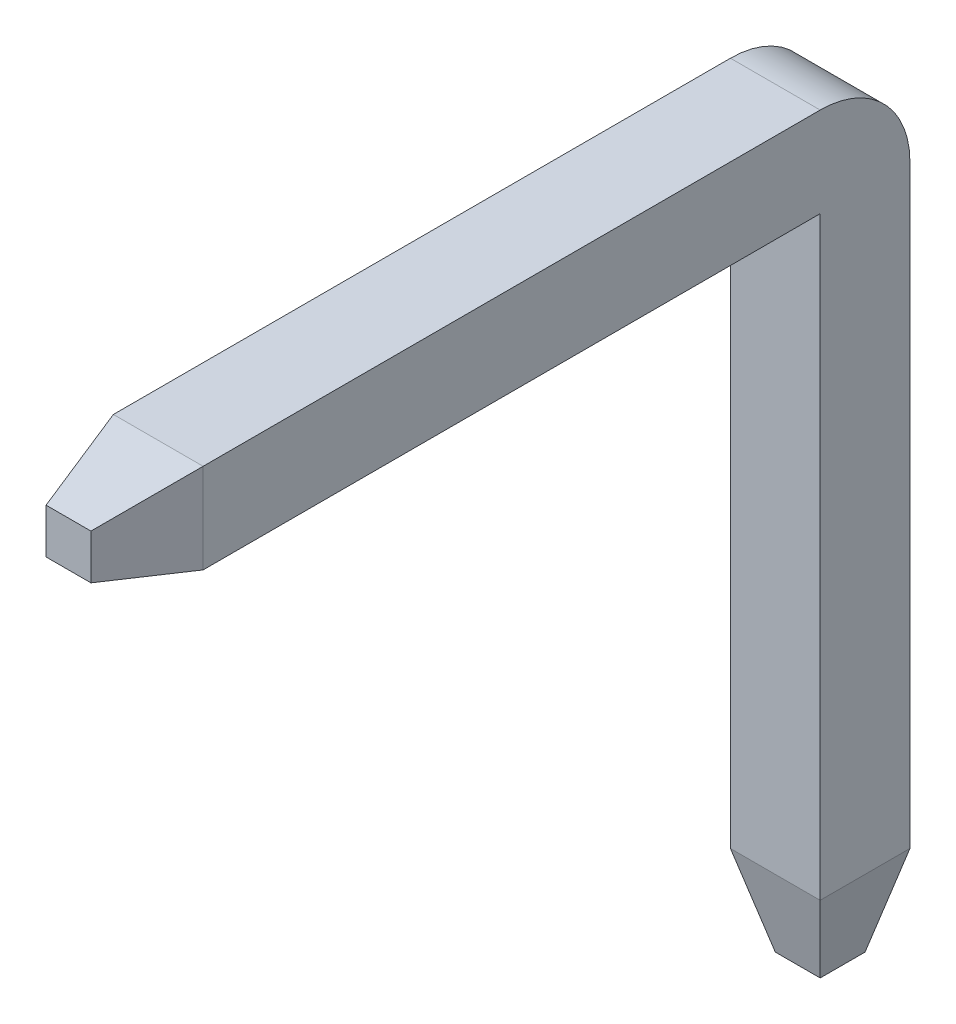
ISO-10303-21;
HEADER;
FILE_DESCRIPTION(('STEP AP214'),'2;1');
FILE_NAME('part.step','',(''),(''),'','','');
FILE_SCHEMA(('AUTOMOTIVE_DESIGN { 1 0 10303 214 1 1 1 1 }'));
ENDSEC;
DATA;
#1=APPLICATION_CONTEXT('core data for automotive mechanical design processes');
#2=APPLICATION_PROTOCOL_DEFINITION('international standard','automotive_design',2000,#1);
#3=PRODUCT_CONTEXT('',#1,'mechanical');
#4=PRODUCT('Part','Part','',(#3));
#5=PRODUCT_RELATED_PRODUCT_CATEGORY('part','',(#4));
#6=PRODUCT_DEFINITION_FORMATION('','',#4);
#7=PRODUCT_DEFINITION_CONTEXT('part definition',#1,'design');
#8=PRODUCT_DEFINITION('design','',#6,#7);
#9=PRODUCT_DEFINITION_SHAPE('','',#8);
#10=(LENGTH_UNIT() NAMED_UNIT(*) SI_UNIT(.MILLI.,.METRE.));
#11=(NAMED_UNIT(*) PLANE_ANGLE_UNIT() SI_UNIT($,.RADIAN.));
#12=(NAMED_UNIT(*) SI_UNIT($,.STERADIAN.) SOLID_ANGLE_UNIT());
#13=UNCERTAINTY_MEASURE_WITH_UNIT(LENGTH_MEASURE(1.E-05),#10,'distance_accuracy_value','');
#14=(GEOMETRIC_REPRESENTATION_CONTEXT(3) GLOBAL_UNCERTAINTY_ASSIGNED_CONTEXT((#13)) GLOBAL_UNIT_ASSIGNED_CONTEXT((#10,
#11,#12)) REPRESENTATION_CONTEXT('',''));
#15=CARTESIAN_POINT('',(0.,0.,0.));
#16=DIRECTION('',(0.,0.,1.));
#17=DIRECTION('',(1.,0.,0.));
#18=AXIS2_PLACEMENT_3D('',#15,#16,#17);
#19=CARTESIAN_POINT('',(0.4,-3.05,-3.95));
#20=DIRECTION('',(0.,-1.,0.));
#21=DIRECTION('',(0.,0.,-1.));
#22=AXIS2_PLACEMENT_3D('',#19,#20,#21);
#23=PLANE('',#22);
#24=DIRECTION('',(0.,0.,1.));
#25=VECTOR('',#24,1.);
#26=CARTESIAN_POINT('',(0.200000000000002,-3.05,-3.15));
#27=LINE('',#26,#25);
#28=CARTESIAN_POINT('',(0.200000000000002,-3.05,-3.75));
#29=VERTEX_POINT('',#28);
#30=CARTESIAN_POINT('',(0.200000000000002,-3.05,-3.35));
#31=VERTEX_POINT('',#30);
#32=EDGE_CURVE('E202',#29,#31,#27,.T.);
#33=ORIENTED_EDGE('',*,*,#32,.T.);
#34=DIRECTION('',(-1.,0.,0.));
#35=VECTOR('',#34,1.);
#36=CARTESIAN_POINT('',(0.4,-3.05,-3.35));
#37=LINE('',#36,#35);
#38=CARTESIAN_POINT('',(-0.200000000000002,-3.05,-3.35));
#39=VERTEX_POINT('',#38);
#40=EDGE_CURVE('E165',#31,#39,#37,.T.);
#41=ORIENTED_EDGE('',*,*,#40,.T.);
#42=DIRECTION('',(0.,0.,-1.));
#43=VECTOR('',#42,1.);
#44=CARTESIAN_POINT('',(-0.200000000000002,-3.05,-3.95));
#45=LINE('',#44,#43);
#46=CARTESIAN_POINT('',(-0.200000000000002,-3.05,-3.75));
#47=VERTEX_POINT('',#46);
#48=EDGE_CURVE('E199',#39,#47,#45,.T.);
#49=ORIENTED_EDGE('',*,*,#48,.T.);
#50=DIRECTION('',(1.,0.,0.));
#51=VECTOR('',#50,1.);
#52=CARTESIAN_POINT('',(0.4,-3.05,-3.75));
#53=LINE('',#52,#51);
#54=EDGE_CURVE('E197',#47,#29,#53,.T.);
#55=ORIENTED_EDGE('',*,*,#54,.T.);
#56=EDGE_LOOP('',(#33,#41,#49,#55));
#57=FACE_BOUND('',#56,.T.);
#58=ADVANCED_FACE('F34',(#57),#23,.T.);
#59=CARTESIAN_POINT('',(0.4,3.85,-3.95));
#60=DIRECTION('',(0.,0.,-1.));
#61=DIRECTION('',(-1.,0.,0.));
#62=AXIS2_PLACEMENT_3D('',#59,#60,#61);
#63=PLANE('',#62);
#64=DIRECTION('',(0.,-1.,0.));
#65=VECTOR('',#64,1.);
#66=CARTESIAN_POINT('',(-0.4,3.85,-3.95));
#67=LINE('',#66,#65);
#68=CARTESIAN_POINT('',(-0.4,3.05,-3.95));
#69=VERTEX_POINT('',#68);
#70=CARTESIAN_POINT('',(-0.4,-2.25000000000002,-3.95));
#71=VERTEX_POINT('',#70);
#72=EDGE_CURVE('E137',#69,#71,#67,.T.);
#73=ORIENTED_EDGE('',*,*,#72,.F.);
#74=DIRECTION('',(-1.,0.,0.));
#75=VECTOR('',#74,1.);
#76=CARTESIAN_POINT('',(0.4,3.05,-3.95));
#77=LINE('',#76,#75);
#78=CARTESIAN_POINT('',(0.4,3.05,-3.95));
#79=VERTEX_POINT('',#78);
#80=EDGE_CURVE('E42',#69,#79,#77,.F.);
#81=ORIENTED_EDGE('',*,*,#80,.T.);
#82=DIRECTION('',(0.,-1.,0.));
#83=VECTOR('',#82,1.);
#84=CARTESIAN_POINT('',(0.4,3.85,-3.95));
#85=LINE('',#84,#83);
#86=CARTESIAN_POINT('',(0.4,-2.25000000000002,-3.95));
#87=VERTEX_POINT('',#86);
#88=EDGE_CURVE('E200',#79,#87,#85,.T.);
#89=ORIENTED_EDGE('',*,*,#88,.T.);
#90=DIRECTION('',(-1.,0.,0.));
#91=VECTOR('',#90,1.);
#92=CARTESIAN_POINT('',(0.4,-2.25000000000002,-3.95));
#93=LINE('',#92,#91);
#94=EDGE_CURVE('E169',#87,#71,#93,.T.);
#95=ORIENTED_EDGE('',*,*,#94,.T.);
#96=EDGE_LOOP('',(#73,#81,#89,#95));
#97=FACE_BOUND('',#96,.T.);
#98=ADVANCED_FACE('F266',(#97),#63,.T.);
#99=CARTESIAN_POINT('',(0.4,3.85,-3.15));
#100=DIRECTION('',(0.,1.,0.));
#101=DIRECTION('',(0.,0.,1.));
#102=AXIS2_PLACEMENT_3D('',#99,#100,#101);
#103=PLANE('',#102);
#104=DIRECTION('',(0.,0.,-1.));
#105=VECTOR('',#104,1.);
#106=CARTESIAN_POINT('',(0.4,3.85,-3.15));
#107=LINE('',#106,#105);
#108=CARTESIAN_POINT('',(0.4,3.85000000000003,2.35000000000002));
#109=VERTEX_POINT('',#108);
#110=CARTESIAN_POINT('',(0.4,3.85,-3.15));
#111=VERTEX_POINT('',#110);
#112=EDGE_CURVE('E136',#109,#111,#107,.T.);
#113=ORIENTED_EDGE('',*,*,#112,.T.);
#114=DIRECTION('',(-1.,0.,0.));
#115=VECTOR('',#114,1.);
#116=CARTESIAN_POINT('',(0.4,3.85,-3.15));
#117=LINE('',#116,#115);
#118=CARTESIAN_POINT('',(-0.4,3.85,-3.15));
#119=VERTEX_POINT('',#118);
#120=EDGE_CURVE('E229',#111,#119,#117,.T.);
#121=ORIENTED_EDGE('',*,*,#120,.T.);
#122=DIRECTION('',(0.,0.,-1.));
#123=VECTOR('',#122,1.);
#124=CARTESIAN_POINT('',(-0.4,3.85,-3.15));
#125=LINE('',#124,#123);
#126=CARTESIAN_POINT('',(-0.4,3.85000000000003,2.35000000000002));
#127=VERTEX_POINT('',#126);
#128=EDGE_CURVE('E263',#127,#119,#125,.T.);
#129=ORIENTED_EDGE('',*,*,#128,.F.);
#130=DIRECTION('',(1.,0.,0.));
#131=VECTOR('',#130,1.);
#132=CARTESIAN_POINT('',(0.4,3.85000000000003,2.35000000000002));
#133=LINE('',#132,#131);
#134=EDGE_CURVE('E188',#127,#109,#133,.T.);
#135=ORIENTED_EDGE('',*,*,#134,.T.);
#136=EDGE_LOOP('',(#113,#121,#129,#135));
#137=FACE_BOUND('',#136,.T.);
#138=ADVANCED_FACE('F262',(#137),#103,.T.);
#139=CARTESIAN_POINT('',(0.4,-3.05,-3.15));
#140=DIRECTION('',(0.,0.,1.));
#141=DIRECTION('',(0.,-1.,0.));
#142=AXIS2_PLACEMENT_3D('',#139,#140,#141);
#143=PLANE('',#142);
#144=DIRECTION('',(0.,1.,0.));
#145=VECTOR('',#144,1.);
#146=CARTESIAN_POINT('',(-0.4,-3.05,-3.15));
#147=LINE('',#146,#145);
#148=CARTESIAN_POINT('',(-0.4,-2.25000000000002,-3.15));
#149=VERTEX_POINT('',#148);
#150=CARTESIAN_POINT('',(-0.4,3.05,-3.15));
#151=VERTEX_POINT('',#150);
#152=EDGE_CURVE('E160',#149,#151,#147,.T.);
#153=ORIENTED_EDGE('',*,*,#152,.F.);
#154=DIRECTION('',(1.,0.,0.));
#155=VECTOR('',#154,1.);
#156=CARTESIAN_POINT('',(0.4,-2.25000000000002,-3.15));
#157=LINE('',#156,#155);
#158=CARTESIAN_POINT('',(0.4,-2.25000000000002,-3.15));
#159=VERTEX_POINT('',#158);
#160=EDGE_CURVE('E135',#149,#159,#157,.T.);
#161=ORIENTED_EDGE('',*,*,#160,.T.);
#162=DIRECTION('',(0.,1.,0.));
#163=VECTOR('',#162,1.);
#164=CARTESIAN_POINT('',(0.4,-3.05,-3.15));
#165=LINE('',#164,#163);
#166=CARTESIAN_POINT('',(0.4,3.05,-3.15));
#167=VERTEX_POINT('',#166);
#168=EDGE_CURVE('E119',#159,#167,#165,.T.);
#169=ORIENTED_EDGE('',*,*,#168,.T.);
#170=DIRECTION('',(1.,0.,0.));
#171=VECTOR('',#170,1.);
#172=CARTESIAN_POINT('',(0.4,3.05,-3.15));
#173=LINE('',#172,#171);
#174=EDGE_CURVE('E127',#151,#167,#173,.T.);
#175=ORIENTED_EDGE('',*,*,#174,.F.);
#176=EDGE_LOOP('',(#153,#161,#169,#175));
#177=FACE_BOUND('',#176,.T.);
#178=ADVANCED_FACE('F133',(#177),#143,.T.);
#179=CARTESIAN_POINT('',(0.4,0.,0.));
#180=DIRECTION('',(-1.,0.,0.));
#181=DIRECTION('',(0.,0.,1.));
#182=AXIS2_PLACEMENT_3D('',#179,#180,#181);
#183=PLANE('',#182);
#184=ORIENTED_EDGE('',*,*,#88,.F.);
#185=CARTESIAN_POINT('',(0.4,3.05,-3.15));
#186=DIRECTION('',(-1.,0.,0.));
#187=DIRECTION('',(0.,0.,1.));
#188=AXIS2_PLACEMENT_3D('',#185,#186,#187);
#189=CIRCLE('',#188,0.8);
#190=EDGE_CURVE('E11',#79,#111,#189,.F.);
#191=ORIENTED_EDGE('',*,*,#190,.T.);
#192=ORIENTED_EDGE('',*,*,#112,.F.);
#193=DIRECTION('',(0.,-1.,0.));
#194=VECTOR('',#193,1.);
#195=CARTESIAN_POINT('',(0.4,0.,2.35000000000002));
#196=LINE('',#195,#194);
#197=CARTESIAN_POINT('',(0.4,3.05,2.35000000000002));
#198=VERTEX_POINT('',#197);
#199=EDGE_CURVE('E122',#109,#198,#196,.T.);
#200=ORIENTED_EDGE('',*,*,#199,.T.);
#201=DIRECTION('',(0.,0.,-1.));
#202=VECTOR('',#201,1.);
#203=CARTESIAN_POINT('',(0.4,3.05,3.15));
#204=LINE('',#203,#202);
#205=EDGE_CURVE('E115',#198,#167,#204,.T.);
#206=ORIENTED_EDGE('',*,*,#205,.T.);
#207=ORIENTED_EDGE('',*,*,#168,.F.);
#208=DIRECTION('',(0.,0.,-1.));
#209=VECTOR('',#208,1.);
#210=CARTESIAN_POINT('',(0.4,-2.25000000000002,-3.95));
#211=LINE('',#210,#209);
#212=EDGE_CURVE('E164',#159,#87,#211,.T.);
#213=ORIENTED_EDGE('',*,*,#212,.T.);
#214=EDGE_LOOP('',(#184,#191,#192,#200,#206,#207,#213));
#215=FACE_BOUND('',#214,.T.);
#216=ADVANCED_FACE('F117',(#215),#183,.F.);
#217=CARTESIAN_POINT('',(-0.4,0.,0.));
#218=DIRECTION('',(-1.,0.,0.));
#219=DIRECTION('',(0.,0.,1.));
#220=AXIS2_PLACEMENT_3D('',#217,#218,#219);
#221=PLANE('',#220);
#222=ORIENTED_EDGE('',*,*,#128,.T.);
#223=CARTESIAN_POINT('',(-0.4,3.05,-3.15));
#224=DIRECTION('',(-1.,0.,0.));
#225=DIRECTION('',(0.,0.,1.));
#226=AXIS2_PLACEMENT_3D('',#223,#224,#225);
#227=CIRCLE('',#226,0.8);
#228=EDGE_CURVE('E56',#119,#69,#227,.T.);
#229=ORIENTED_EDGE('',*,*,#228,.T.);
#230=ORIENTED_EDGE('',*,*,#72,.T.);
#231=DIRECTION('',(0.,0.,1.));
#232=VECTOR('',#231,1.);
#233=CARTESIAN_POINT('',(-0.4,-2.25000000000001,0.));
#234=LINE('',#233,#232);
#235=EDGE_CURVE('E167',#71,#149,#234,.T.);
#236=ORIENTED_EDGE('',*,*,#235,.T.);
#237=ORIENTED_EDGE('',*,*,#152,.T.);
#238=DIRECTION('',(0.,0.,-1.));
#239=VECTOR('',#238,1.);
#240=CARTESIAN_POINT('',(-0.4,3.05,3.15));
#241=LINE('',#240,#239);
#242=CARTESIAN_POINT('',(-0.4,3.05,2.35000000000002));
#243=VERTEX_POINT('',#242);
#244=EDGE_CURVE('E126',#243,#151,#241,.T.);
#245=ORIENTED_EDGE('',*,*,#244,.F.);
#246=DIRECTION('',(0.,1.,0.));
#247=VECTOR('',#246,1.);
#248=CARTESIAN_POINT('',(-0.4,3.85,2.35000000000002));
#249=LINE('',#248,#247);
#250=EDGE_CURVE('E192',#243,#127,#249,.T.);
#251=ORIENTED_EDGE('',*,*,#250,.T.);
#252=EDGE_LOOP('',(#222,#229,#230,#236,#237,#245,#251));
#253=FACE_BOUND('',#252,.T.);
#254=ADVANCED_FACE('F265',(#253),#221,.T.);
#255=CARTESIAN_POINT('',(0.4,3.05,3.15));
#256=DIRECTION('',(0.,1.,0.));
#257=DIRECTION('',(0.,0.,1.));
#258=AXIS2_PLACEMENT_3D('',#255,#256,#257);
#259=PLANE('',#258);
#260=ORIENTED_EDGE('',*,*,#205,.F.);
#261=DIRECTION('',(-1.,0.,0.));
#262=VECTOR('',#261,1.);
#263=CARTESIAN_POINT('',(0.4,3.05,2.35000000000002));
#264=LINE('',#263,#262);
#265=EDGE_CURVE('E232',#198,#243,#264,.T.);
#266=ORIENTED_EDGE('',*,*,#265,.T.);
#267=ORIENTED_EDGE('',*,*,#244,.T.);
#268=ORIENTED_EDGE('',*,*,#174,.T.);
#269=EDGE_LOOP('',(#260,#266,#267,#268));
#270=FACE_BOUND('',#269,.T.);
#271=ADVANCED_FACE('F139',(#270),#259,.F.);
#272=CARTESIAN_POINT('',(0.,0.,3.15));
#273=DIRECTION('',(0.,0.,-1.));
#274=DIRECTION('',(-1.,0.,0.));
#275=AXIS2_PLACEMENT_3D('',#272,#273,#274);
#276=PLANE('',#275);
#277=DIRECTION('',(0.,1.,0.));
#278=VECTOR('',#277,1.);
#279=CARTESIAN_POINT('',(0.2,0.,3.15));
#280=LINE('',#279,#278);
#281=CARTESIAN_POINT('',(0.2,3.25,3.15));
#282=VERTEX_POINT('',#281);
#283=CARTESIAN_POINT('',(0.2,3.65000000000003,3.15));
#284=VERTEX_POINT('',#283);
#285=EDGE_CURVE('E183',#282,#284,#280,.T.);
#286=ORIENTED_EDGE('',*,*,#285,.T.);
#287=DIRECTION('',(-1.,0.,0.));
#288=VECTOR('',#287,1.);
#289=CARTESIAN_POINT('',(-0.4,3.65000000000003,3.15));
#290=LINE('',#289,#288);
#291=CARTESIAN_POINT('',(-0.2,3.65000000000003,3.15));
#292=VERTEX_POINT('',#291);
#293=EDGE_CURVE('E185',#284,#292,#290,.T.);
#294=ORIENTED_EDGE('',*,*,#293,.T.);
#295=DIRECTION('',(0.,-1.,0.));
#296=VECTOR('',#295,1.);
#297=CARTESIAN_POINT('',(-0.2,3.05,3.15));
#298=LINE('',#297,#296);
#299=CARTESIAN_POINT('',(-0.2,3.25,3.15));
#300=VERTEX_POINT('',#299);
#301=EDGE_CURVE('E181',#292,#300,#298,.T.);
#302=ORIENTED_EDGE('',*,*,#301,.T.);
#303=DIRECTION('',(1.,0.,0.));
#304=VECTOR('',#303,1.);
#305=CARTESIAN_POINT('',(0.,3.25,3.15));
#306=LINE('',#305,#304);
#307=EDGE_CURVE('E172',#300,#282,#306,.T.);
#308=ORIENTED_EDGE('',*,*,#307,.T.);
#309=EDGE_LOOP('',(#286,#294,#302,#308));
#310=FACE_BOUND('',#309,.T.);
#311=ADVANCED_FACE('F256',(#310),#276,.F.);
#312=CARTESIAN_POINT('',(0.4,-2.25000000000002,-3.95));
#313=DIRECTION('',(0.,0.242535625036337,0.970142500145331));
#314=DIRECTION('',(-1.,0.,0.));
#315=AXIS2_PLACEMENT_3D('',#312,#313,#314);
#316=PLANE('',#315);
#317=DIRECTION('',(-0.235702260395519,0.942809041582062,-0.23570226039552));
#318=VECTOR('',#317,1.);
#319=CARTESIAN_POINT('',(-0.355555555555555,-2.4277777777778,-3.90555555555556));
#320=LINE('',#319,#318);
#321=EDGE_CURVE('E145',#71,#47,#320,.F.);
#322=ORIENTED_EDGE('',*,*,#321,.F.);
#323=ORIENTED_EDGE('',*,*,#94,.F.);
#324=DIRECTION('',(0.235702260395519,0.942809041582062,-0.23570226039552));
#325=VECTOR('',#324,1.);
#326=CARTESIAN_POINT('',(0.4,-2.25000000000002,-3.95));
#327=LINE('',#326,#325);
#328=EDGE_CURVE('E142',#29,#87,#327,.T.);
#329=ORIENTED_EDGE('',*,*,#328,.F.);
#330=ORIENTED_EDGE('',*,*,#54,.F.);
#331=EDGE_LOOP('',(#322,#323,#329,#330));
#332=FACE_BOUND('',#331,.T.);
#333=ADVANCED_FACE('F220',(#332),#316,.F.);
#334=CARTESIAN_POINT('',(0.200000000000002,-3.05,-3.95));
#335=DIRECTION('',(0.970142500145331,-0.242535625036336,0.));
#336=DIRECTION('',(0.,0.,-1.));
#337=AXIS2_PLACEMENT_3D('',#334,#335,#336);
#338=PLANE('',#337);
#339=ORIENTED_EDGE('',*,*,#328,.T.);
#340=ORIENTED_EDGE('',*,*,#212,.F.);
#341=DIRECTION('',(0.235702260395519,0.942809041582062,0.235702260395518));
#342=VECTOR('',#341,1.);
#343=CARTESIAN_POINT('',(0.166666666666667,-3.18333333333334,-3.38333333333333));
#344=LINE('',#343,#342);
#345=EDGE_CURVE('E175',#31,#159,#344,.T.);
#346=ORIENTED_EDGE('',*,*,#345,.F.);
#347=ORIENTED_EDGE('',*,*,#32,.F.);
#348=EDGE_LOOP('',(#339,#340,#346,#347));
#349=FACE_BOUND('',#348,.T.);
#350=ADVANCED_FACE('F223',(#349),#338,.T.);
#351=CARTESIAN_POINT('',(-0.4,-2.25000000000001,0.));
#352=DIRECTION('',(0.970142500145331,0.242535625036336,0.));
#353=DIRECTION('',(0.,0.,1.));
#354=AXIS2_PLACEMENT_3D('',#351,#352,#353);
#355=PLANE('',#354);
#356=ORIENTED_EDGE('',*,*,#321,.T.);
#357=ORIENTED_EDGE('',*,*,#48,.F.);
#358=DIRECTION('',(-0.235702260395519,0.942809041582062,0.235702260395518));
#359=VECTOR('',#358,1.);
#360=CARTESIAN_POINT('',(-0.575000000000004,-1.55000000000001,-2.975));
#361=LINE('',#360,#359);
#362=EDGE_CURVE('E173',#149,#39,#361,.F.);
#363=ORIENTED_EDGE('',*,*,#362,.F.);
#364=ORIENTED_EDGE('',*,*,#235,.F.);
#365=EDGE_LOOP('',(#356,#357,#363,#364));
#366=FACE_BOUND('',#365,.T.);
#367=ADVANCED_FACE('F216',(#366),#355,.F.);
#368=CARTESIAN_POINT('',(0.4,-3.05,-3.35));
#369=DIRECTION('',(0.,0.242535625036335,-0.970142500145331));
#370=DIRECTION('',(-1.,0.,0.));
#371=AXIS2_PLACEMENT_3D('',#368,#369,#370);
#372=PLANE('',#371);
#373=ORIENTED_EDGE('',*,*,#345,.T.);
#374=ORIENTED_EDGE('',*,*,#160,.F.);
#375=ORIENTED_EDGE('',*,*,#362,.T.);
#376=ORIENTED_EDGE('',*,*,#40,.F.);
#377=EDGE_LOOP('',(#373,#374,#375,#376));
#378=FACE_BOUND('',#377,.T.);
#379=ADVANCED_FACE('F211',(#378),#372,.F.);
#380=CARTESIAN_POINT('',(0.,3.25,3.15));
#381=DIRECTION('',(0.,0.970142500145331,-0.242535625036337));
#382=DIRECTION('',(1.,0.,0.));
#383=AXIS2_PLACEMENT_3D('',#380,#381,#382);
#384=PLANE('',#383);
#385=DIRECTION('',(0.23570226039552,0.23570226039552,0.942809041582061));
#386=VECTOR('',#385,1.);
#387=CARTESIAN_POINT('',(-0.188888888888889,3.26111111111111,3.19444444444445));
#388=LINE('',#387,#386);
#389=EDGE_CURVE('E238',#243,#300,#388,.T.);
#390=ORIENTED_EDGE('',*,*,#389,.F.);
#391=ORIENTED_EDGE('',*,*,#265,.F.);
#392=DIRECTION('',(-0.23570226039552,0.23570226039552,0.942809041582061));
#393=VECTOR('',#392,1.);
#394=CARTESIAN_POINT('',(0.188888888888889,3.26111111111111,3.19444444444445));
#395=LINE('',#394,#393);
#396=EDGE_CURVE('E176',#282,#198,#395,.F.);
#397=ORIENTED_EDGE('',*,*,#396,.F.);
#398=ORIENTED_EDGE('',*,*,#307,.F.);
#399=EDGE_LOOP('',(#390,#391,#397,#398));
#400=FACE_BOUND('',#399,.T.);
#401=ADVANCED_FACE('F282',(#400),#384,.F.);
#402=CARTESIAN_POINT('',(0.2,0.,3.15));
#403=DIRECTION('',(-0.970142500145331,0.,-0.242535625036337));
#404=DIRECTION('',(0.,1.,0.));
#405=AXIS2_PLACEMENT_3D('',#402,#403,#404);
#406=PLANE('',#405);
#407=ORIENTED_EDGE('',*,*,#396,.T.);
#408=ORIENTED_EDGE('',*,*,#199,.F.);
#409=DIRECTION('',(0.23570226039552,0.23570226039552,-0.942809041582061));
#410=VECTOR('',#409,1.);
#411=CARTESIAN_POINT('',(-0.00277777777778592,3.44722222222224,3.96111111111113));
#412=LINE('',#411,#410);
#413=EDGE_CURVE('E241',#284,#109,#412,.T.);
#414=ORIENTED_EDGE('',*,*,#413,.F.);
#415=ORIENTED_EDGE('',*,*,#285,.F.);
#416=EDGE_LOOP('',(#407,#408,#414,#415));
#417=FACE_BOUND('',#416,.T.);
#418=ADVANCED_FACE('F261',(#417),#406,.F.);
#419=CARTESIAN_POINT('',(-0.2,0.,3.15));
#420=DIRECTION('',(-0.970142500145331,0.,0.242535625036337));
#421=DIRECTION('',(0.,1.,0.));
#422=AXIS2_PLACEMENT_3D('',#419,#420,#421);
#423=PLANE('',#422);
#424=ORIENTED_EDGE('',*,*,#389,.T.);
#425=ORIENTED_EDGE('',*,*,#301,.F.);
#426=DIRECTION('',(-0.23570226039552,0.23570226039552,-0.942809041582061));
#427=VECTOR('',#426,1.);
#428=CARTESIAN_POINT('',(0.00277777777778592,3.44722222222224,3.96111111111113));
#429=LINE('',#428,#427);
#430=EDGE_CURVE('E243',#127,#292,#429,.F.);
#431=ORIENTED_EDGE('',*,*,#430,.F.);
#432=ORIENTED_EDGE('',*,*,#250,.F.);
#433=EDGE_LOOP('',(#424,#425,#431,#432));
#434=FACE_BOUND('',#433,.T.);
#435=ADVANCED_FACE('F252',(#434),#423,.T.);
#436=CARTESIAN_POINT('',(0.,3.65000000000003,3.15));
#437=DIRECTION('',(0.,0.970142500145331,0.242535625036337));
#438=DIRECTION('',(1.,0.,0.));
#439=AXIS2_PLACEMENT_3D('',#436,#437,#438);
#440=PLANE('',#439);
#441=ORIENTED_EDGE('',*,*,#413,.T.);
#442=ORIENTED_EDGE('',*,*,#134,.F.);
#443=ORIENTED_EDGE('',*,*,#430,.T.);
#444=ORIENTED_EDGE('',*,*,#293,.F.);
#445=EDGE_LOOP('',(#441,#442,#443,#444));
#446=FACE_BOUND('',#445,.T.);
#447=ADVANCED_FACE('F249',(#446),#440,.T.);
#448=CARTESIAN_POINT('',(0.4,3.05,-3.15));
#449=DIRECTION('',(-1.,0.,0.));
#450=DIRECTION('',(0.,0.,1.));
#451=AXIS2_PLACEMENT_3D('',#448,#449,#450);
#452=CYLINDRICAL_SURFACE('',#451,0.8);
#453=ORIENTED_EDGE('',*,*,#190,.F.);
#454=ORIENTED_EDGE('',*,*,#80,.F.);
#455=ORIENTED_EDGE('',*,*,#228,.F.);
#456=ORIENTED_EDGE('',*,*,#120,.F.);
#457=EDGE_LOOP('',(#453,#454,#455,#456));
#458=FACE_BOUND('',#457,.T.);
#459=ADVANCED_FACE('F36',(#458),#452,.T.);
#460=CLOSED_SHELL('',(#58,#98,#138,#178,#216,#254,#271,#311,#333,#350,#367,#379,#401,#418,#435,
#447,#459));
#461=MANIFOLD_SOLID_BREP('B2',#460);
#462=ADVANCED_BREP_SHAPE_REPRESENTATION('',(#18,#461),#14);
#463=SHAPE_DEFINITION_REPRESENTATION(#9,#462);
ENDSEC;
END-ISO-10303-21;
